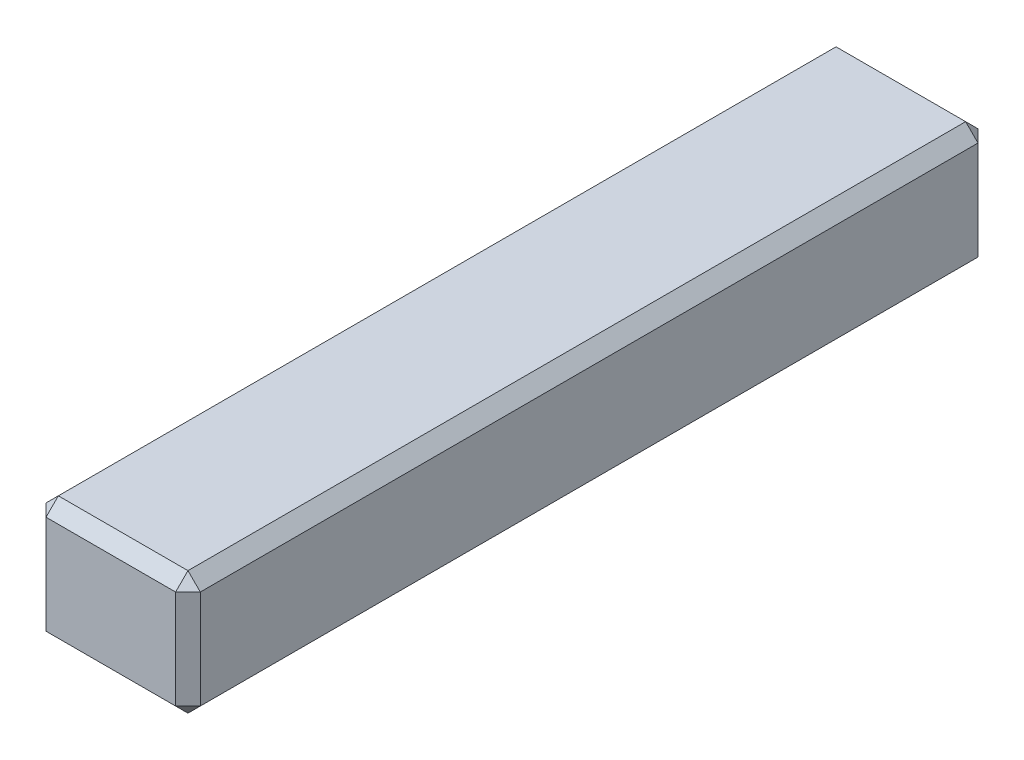
ISO-10303-21;
HEADER;
FILE_DESCRIPTION(('STEP AP214'),'2;1');
FILE_NAME('part.step','',(''),(''),'','','');
FILE_SCHEMA(('AUTOMOTIVE_DESIGN { 1 0 10303 214 1 1 1 1 }'));
ENDSEC;
DATA;
#1=APPLICATION_CONTEXT('core data for automotive mechanical design processes');
#2=APPLICATION_PROTOCOL_DEFINITION('international standard','automotive_design',2000,#1);
#3=PRODUCT_CONTEXT('',#1,'mechanical');
#4=PRODUCT('Part','Part','',(#3));
#5=PRODUCT_RELATED_PRODUCT_CATEGORY('part','',(#4));
#6=PRODUCT_DEFINITION_FORMATION('','',#4);
#7=PRODUCT_DEFINITION_CONTEXT('part definition',#1,'design');
#8=PRODUCT_DEFINITION('design','',#6,#7);
#9=PRODUCT_DEFINITION_SHAPE('','',#8);
#10=(LENGTH_UNIT() NAMED_UNIT(*) SI_UNIT(.MILLI.,.METRE.));
#11=(NAMED_UNIT(*) PLANE_ANGLE_UNIT() SI_UNIT($,.RADIAN.));
#12=(NAMED_UNIT(*) SI_UNIT($,.STERADIAN.) SOLID_ANGLE_UNIT());
#13=UNCERTAINTY_MEASURE_WITH_UNIT(LENGTH_MEASURE(1.E-05),#10,'distance_accuracy_value','');
#14=(GEOMETRIC_REPRESENTATION_CONTEXT(3) GLOBAL_UNCERTAINTY_ASSIGNED_CONTEXT((#13)) GLOBAL_UNIT_ASSIGNED_CONTEXT((#10,
#11,#12)) REPRESENTATION_CONTEXT('',''));
#15=CARTESIAN_POINT('',(0.,0.,0.));
#16=DIRECTION('',(0.,0.,1.));
#17=DIRECTION('',(1.,0.,0.));
#18=AXIS2_PLACEMENT_3D('',#15,#16,#17);
#19=CARTESIAN_POINT('',(1.25,1.,6.5));
#20=DIRECTION('',(-1.,0.,0.));
#21=DIRECTION('',(0.,0.,1.));
#22=AXIS2_PLACEMENT_3D('',#19,#20,#21);
#23=PLANE('',#22);
#24=DIRECTION('',(0.,0.,1.));
#25=VECTOR('',#24,1.);
#26=CARTESIAN_POINT('',(1.25,0.799999999999998,6.5));
#27=LINE('',#26,#25);
#28=CARTESIAN_POINT('',(1.25,0.799999999999998,-6.3));
#29=VERTEX_POINT('',#28);
#30=CARTESIAN_POINT('',(1.25,0.799999999999998,6.3));
#31=VERTEX_POINT('',#30);
#32=EDGE_CURVE('E59',#29,#31,#27,.T.);
#33=ORIENTED_EDGE('',*,*,#32,.T.);
#34=DIRECTION('',(0.,-1.,0.));
#35=VECTOR('',#34,1.);
#36=CARTESIAN_POINT('',(1.25,1.,6.3));
#37=LINE('',#36,#35);
#38=CARTESIAN_POINT('',(1.25,-0.799999999999998,6.3));
#39=VERTEX_POINT('',#38);
#40=EDGE_CURVE('E11',#31,#39,#37,.T.);
#41=ORIENTED_EDGE('',*,*,#40,.T.);
#42=DIRECTION('',(0.,0.,-1.));
#43=VECTOR('',#42,1.);
#44=CARTESIAN_POINT('',(1.25,-0.799999999999998,-6.5));
#45=LINE('',#44,#43);
#46=CARTESIAN_POINT('',(1.25,-0.799999999999998,-6.3));
#47=VERTEX_POINT('',#46);
#48=EDGE_CURVE('E232',#39,#47,#45,.T.);
#49=ORIENTED_EDGE('',*,*,#48,.T.);
#50=DIRECTION('',(0.,1.,0.));
#51=VECTOR('',#50,1.);
#52=CARTESIAN_POINT('',(1.25,1.,-6.3));
#53=LINE('',#52,#51);
#54=EDGE_CURVE('E68',#47,#29,#53,.T.);
#55=ORIENTED_EDGE('',*,*,#54,.T.);
#56=EDGE_LOOP('',(#33,#41,#49,#55));
#57=FACE_BOUND('',#56,.T.);
#58=ADVANCED_FACE('F50',(#57),#23,.F.);
#59=CARTESIAN_POINT('',(-1.25,1.,-6.5));
#60=DIRECTION('',(0.,0.,1.));
#61=DIRECTION('',(1.,0.,0.));
#62=AXIS2_PLACEMENT_3D('',#59,#60,#61);
#63=PLANE('',#62);
#64=DIRECTION('',(0.,1.,0.));
#65=VECTOR('',#64,1.);
#66=CARTESIAN_POINT('',(-1.05,1.,-6.5));
#67=LINE('',#66,#65);
#68=CARTESIAN_POINT('',(-1.05,-0.799999999999998,-6.5));
#69=VERTEX_POINT('',#68);
#70=CARTESIAN_POINT('',(-1.05,0.799999999999998,-6.5));
#71=VERTEX_POINT('',#70);
#72=EDGE_CURVE('E200',#69,#71,#67,.T.);
#73=ORIENTED_EDGE('',*,*,#72,.T.);
#74=DIRECTION('',(1.,0.,0.));
#75=VECTOR('',#74,1.);
#76=CARTESIAN_POINT('',(-1.25,0.799999999999998,-6.5));
#77=LINE('',#76,#75);
#78=CARTESIAN_POINT('',(1.05,0.799999999999998,-6.5));
#79=VERTEX_POINT('',#78);
#80=EDGE_CURVE('E205',#71,#79,#77,.T.);
#81=ORIENTED_EDGE('',*,*,#80,.T.);
#82=DIRECTION('',(0.,-1.,0.));
#83=VECTOR('',#82,1.);
#84=CARTESIAN_POINT('',(1.05,1.,-6.5));
#85=LINE('',#84,#83);
#86=CARTESIAN_POINT('',(1.05,-0.799999999999998,-6.5));
#87=VERTEX_POINT('',#86);
#88=EDGE_CURVE('E194',#79,#87,#85,.T.);
#89=ORIENTED_EDGE('',*,*,#88,.T.);
#90=DIRECTION('',(-1.,0.,0.));
#91=VECTOR('',#90,1.);
#92=CARTESIAN_POINT('',(-1.25,-0.799999999999998,-6.5));
#93=LINE('',#92,#91);
#94=EDGE_CURVE('E198',#87,#69,#93,.T.);
#95=ORIENTED_EDGE('',*,*,#94,.T.);
#96=EDGE_LOOP('',(#73,#81,#89,#95));
#97=FACE_BOUND('',#96,.T.);
#98=ADVANCED_FACE('F380',(#97),#63,.F.);
#99=CARTESIAN_POINT('',(-1.25,1.,6.5));
#100=DIRECTION('',(1.,0.,0.));
#101=DIRECTION('',(0.,0.,-1.));
#102=AXIS2_PLACEMENT_3D('',#99,#100,#101);
#103=PLANE('',#102);
#104=DIRECTION('',(0.,0.,-1.));
#105=VECTOR('',#104,1.);
#106=CARTESIAN_POINT('',(-1.25,0.799999999999998,6.5));
#107=LINE('',#106,#105);
#108=CARTESIAN_POINT('',(-1.25,0.799999999999998,6.3));
#109=VERTEX_POINT('',#108);
#110=CARTESIAN_POINT('',(-1.25,0.799999999999998,-6.3));
#111=VERTEX_POINT('',#110);
#112=EDGE_CURVE('E215',#109,#111,#107,.T.);
#113=ORIENTED_EDGE('',*,*,#112,.T.);
#114=DIRECTION('',(0.,-1.,0.));
#115=VECTOR('',#114,1.);
#116=CARTESIAN_POINT('',(-1.25,1.,-6.3));
#117=LINE('',#116,#115);
#118=CARTESIAN_POINT('',(-1.25,-0.799999999999998,-6.3));
#119=VERTEX_POINT('',#118);
#120=EDGE_CURVE('E214',#111,#119,#117,.T.);
#121=ORIENTED_EDGE('',*,*,#120,.T.);
#122=DIRECTION('',(0.,0.,1.));
#123=VECTOR('',#122,1.);
#124=CARTESIAN_POINT('',(-1.25,-0.799999999999998,6.5));
#125=LINE('',#124,#123);
#126=CARTESIAN_POINT('',(-1.25,-0.799999999999998,6.3));
#127=VERTEX_POINT('',#126);
#128=EDGE_CURVE('E206',#119,#127,#125,.T.);
#129=ORIENTED_EDGE('',*,*,#128,.T.);
#130=DIRECTION('',(0.,1.,0.));
#131=VECTOR('',#130,1.);
#132=CARTESIAN_POINT('',(-1.25,1.,6.3));
#133=LINE('',#132,#131);
#134=EDGE_CURVE('E207',#127,#109,#133,.T.);
#135=ORIENTED_EDGE('',*,*,#134,.T.);
#136=EDGE_LOOP('',(#113,#121,#129,#135));
#137=FACE_BOUND('',#136,.T.);
#138=ADVANCED_FACE('F331',(#137),#103,.F.);
#139=CARTESIAN_POINT('',(-1.25,1.,6.5));
#140=DIRECTION('',(0.,0.,-1.));
#141=DIRECTION('',(-1.,0.,0.));
#142=AXIS2_PLACEMENT_3D('',#139,#140,#141);
#143=PLANE('',#142);
#144=DIRECTION('',(0.,1.,0.));
#145=VECTOR('',#144,1.);
#146=CARTESIAN_POINT('',(1.05,1.,6.5));
#147=LINE('',#146,#145);
#148=CARTESIAN_POINT('',(1.05,-0.799999999999998,6.5));
#149=VERTEX_POINT('',#148);
#150=CARTESIAN_POINT('',(1.05,0.799999999999998,6.5));
#151=VERTEX_POINT('',#150);
#152=EDGE_CURVE('E178',#149,#151,#147,.T.);
#153=ORIENTED_EDGE('',*,*,#152,.T.);
#154=DIRECTION('',(-1.,0.,0.));
#155=VECTOR('',#154,1.);
#156=CARTESIAN_POINT('',(-1.25,0.799999999999998,6.5));
#157=LINE('',#156,#155);
#158=CARTESIAN_POINT('',(-1.05,0.799999999999998,6.5));
#159=VERTEX_POINT('',#158);
#160=EDGE_CURVE('E144',#151,#159,#157,.T.);
#161=ORIENTED_EDGE('',*,*,#160,.T.);
#162=DIRECTION('',(0.,-1.,0.));
#163=VECTOR('',#162,1.);
#164=CARTESIAN_POINT('',(-1.05,1.,6.5));
#165=LINE('',#164,#163);
#166=CARTESIAN_POINT('',(-1.05,-0.799999999999998,6.5));
#167=VERTEX_POINT('',#166);
#168=EDGE_CURVE('E186',#159,#167,#165,.T.);
#169=ORIENTED_EDGE('',*,*,#168,.T.);
#170=DIRECTION('',(1.,0.,0.));
#171=VECTOR('',#170,1.);
#172=CARTESIAN_POINT('',(1.25,-0.799999999999998,6.5));
#173=LINE('',#172,#171);
#174=EDGE_CURVE('E183',#167,#149,#173,.T.);
#175=ORIENTED_EDGE('',*,*,#174,.T.);
#176=EDGE_LOOP('',(#153,#161,#169,#175));
#177=FACE_BOUND('',#176,.T.);
#178=ADVANCED_FACE('F356',(#177),#143,.F.);
#179=CARTESIAN_POINT('',(0.,1.,0.));
#180=DIRECTION('',(0.,-1.,0.));
#181=DIRECTION('',(0.,0.,-1.));
#182=AXIS2_PLACEMENT_3D('',#179,#180,#181);
#183=PLANE('',#182);
#184=DIRECTION('',(-1.,0.,0.));
#185=VECTOR('',#184,1.);
#186=CARTESIAN_POINT('',(0.,1.,-6.3));
#187=LINE('',#186,#185);
#188=CARTESIAN_POINT('',(1.05,1.,-6.3));
#189=VERTEX_POINT('',#188);
#190=CARTESIAN_POINT('',(-1.05,1.,-6.3));
#191=VERTEX_POINT('',#190);
#192=EDGE_CURVE('E166',#189,#191,#187,.T.);
#193=ORIENTED_EDGE('',*,*,#192,.T.);
#194=DIRECTION('',(0.,0.,1.));
#195=VECTOR('',#194,1.);
#196=CARTESIAN_POINT('',(-1.05,1.,0.));
#197=LINE('',#196,#195);
#198=CARTESIAN_POINT('',(-1.05,1.,6.3));
#199=VERTEX_POINT('',#198);
#200=EDGE_CURVE('E171',#191,#199,#197,.T.);
#201=ORIENTED_EDGE('',*,*,#200,.T.);
#202=DIRECTION('',(1.,0.,0.));
#203=VECTOR('',#202,1.);
#204=CARTESIAN_POINT('',(0.,1.,6.3));
#205=LINE('',#204,#203);
#206=CARTESIAN_POINT('',(1.05,1.,6.3));
#207=VERTEX_POINT('',#206);
#208=EDGE_CURVE('E141',#199,#207,#205,.T.);
#209=ORIENTED_EDGE('',*,*,#208,.T.);
#210=DIRECTION('',(0.,0.,-1.));
#211=VECTOR('',#210,1.);
#212=CARTESIAN_POINT('',(1.05,1.,0.));
#213=LINE('',#212,#211);
#214=EDGE_CURVE('E165',#207,#189,#213,.T.);
#215=ORIENTED_EDGE('',*,*,#214,.T.);
#216=EDGE_LOOP('',(#193,#201,#209,#215));
#217=FACE_BOUND('',#216,.T.);
#218=ADVANCED_FACE('F173',(#217),#183,.F.);
#219=CARTESIAN_POINT('',(0.,-1.,0.));
#220=DIRECTION('',(0.,-1.,0.));
#221=DIRECTION('',(0.,0.,-1.));
#222=AXIS2_PLACEMENT_3D('',#219,#220,#221);
#223=PLANE('',#222);
#224=DIRECTION('',(0.,0.,-1.));
#225=VECTOR('',#224,1.);
#226=CARTESIAN_POINT('',(-1.05,-1.,-6.5));
#227=LINE('',#226,#225);
#228=CARTESIAN_POINT('',(-1.05,-1.,6.3));
#229=VERTEX_POINT('',#228);
#230=CARTESIAN_POINT('',(-1.05,-1.,-6.3));
#231=VERTEX_POINT('',#230);
#232=EDGE_CURVE('E223',#229,#231,#227,.T.);
#233=ORIENTED_EDGE('',*,*,#232,.T.);
#234=DIRECTION('',(1.,0.,0.));
#235=VECTOR('',#234,1.);
#236=CARTESIAN_POINT('',(1.25,-1.,-6.3));
#237=LINE('',#236,#235);
#238=CARTESIAN_POINT('',(1.05,-1.,-6.3));
#239=VERTEX_POINT('',#238);
#240=EDGE_CURVE('E226',#231,#239,#237,.T.);
#241=ORIENTED_EDGE('',*,*,#240,.T.);
#242=DIRECTION('',(0.,0.,1.));
#243=VECTOR('',#242,1.);
#244=CARTESIAN_POINT('',(1.05,-1.,6.5));
#245=LINE('',#244,#243);
#246=CARTESIAN_POINT('',(1.05,-1.,6.3));
#247=VERTEX_POINT('',#246);
#248=EDGE_CURVE('E218',#239,#247,#245,.T.);
#249=ORIENTED_EDGE('',*,*,#248,.T.);
#250=DIRECTION('',(-1.,0.,0.));
#251=VECTOR('',#250,1.);
#252=CARTESIAN_POINT('',(-1.25,-1.,6.3));
#253=LINE('',#252,#251);
#254=EDGE_CURVE('E225',#247,#229,#253,.T.);
#255=ORIENTED_EDGE('',*,*,#254,.T.);
#256=EDGE_LOOP('',(#233,#241,#249,#255));
#257=FACE_BOUND('',#256,.T.);
#258=ADVANCED_FACE('F377',(#257),#223,.T.);
#259=CARTESIAN_POINT('',(-1.25,-0.799999999999998,-6.5));
#260=DIRECTION('',(0.,-0.707106781186548,-0.707106781186547));
#261=DIRECTION('',(1.,0.,0.));
#262=AXIS2_PLACEMENT_3D('',#259,#260,#261);
#263=PLANE('',#262);
#264=DIRECTION('',(0.,-0.707106781186547,0.707106781186548));
#265=VECTOR('',#264,1.);
#266=CARTESIAN_POINT('',(-1.05,-0.899999999999999,-6.4));
#267=LINE('',#266,#265);
#268=EDGE_CURVE('E55',#69,#231,#267,.T.);
#269=ORIENTED_EDGE('',*,*,#268,.F.);
#270=ORIENTED_EDGE('',*,*,#94,.F.);
#271=DIRECTION('',(0.,0.707106781186547,-0.707106781186548));
#272=VECTOR('',#271,1.);
#273=CARTESIAN_POINT('',(1.05,-1.,-6.3));
#274=LINE('',#273,#272);
#275=EDGE_CURVE('E310',#239,#87,#274,.T.);
#276=ORIENTED_EDGE('',*,*,#275,.F.);
#277=ORIENTED_EDGE('',*,*,#240,.F.);
#278=EDGE_LOOP('',(#269,#270,#276,#277));
#279=FACE_BOUND('',#278,.T.);
#280=ADVANCED_FACE('F49',(#279),#263,.T.);
#281=CARTESIAN_POINT('',(-1.25,-0.799999999999998,-6.3));
#282=DIRECTION('',(-0.577350269189626,-0.577350269189626,-0.577350269189626));
#283=DIRECTION('',(-0.707106781186547,0.,0.707106781186547));
#284=AXIS2_PLACEMENT_3D('',#281,#282,#283);
#285=PLANE('',#284);
#286=DIRECTION('',(-0.707106781186547,0.,0.707106781186547));
#287=VECTOR('',#286,1.);
#288=CARTESIAN_POINT('',(-1.25,-0.799999999999998,-6.3));
#289=LINE('',#288,#287);
#290=EDGE_CURVE('E302',#69,#119,#289,.T.);
#291=ORIENTED_EDGE('',*,*,#290,.F.);
#292=ORIENTED_EDGE('',*,*,#268,.T.);
#293=DIRECTION('',(-0.707106781186547,0.707106781186547,0.));
#294=VECTOR('',#293,1.);
#295=CARTESIAN_POINT('',(-1.25,-0.799999999999998,-6.3));
#296=LINE('',#295,#294);
#297=EDGE_CURVE('E308',#119,#231,#296,.F.);
#298=ORIENTED_EDGE('',*,*,#297,.F.);
#299=EDGE_LOOP('',(#291,#292,#298));
#300=FACE_BOUND('',#299,.T.);
#301=ADVANCED_FACE('F325',(#300),#285,.T.);
#302=CARTESIAN_POINT('',(1.05,-1.,-6.3));
#303=DIRECTION('',(0.577350269189626,-0.577350269189626,-0.577350269189625));
#304=DIRECTION('',(0.707106781186547,0.707106781186547,0.));
#305=AXIS2_PLACEMENT_3D('',#302,#303,#304);
#306=PLANE('',#305);
#307=DIRECTION('',(-0.707106781186547,-0.707106781186548,0.));
#308=VECTOR('',#307,1.);
#309=CARTESIAN_POINT('',(1.05,-1.,-6.3));
#310=LINE('',#309,#308);
#311=EDGE_CURVE('E294',#239,#47,#310,.F.);
#312=ORIENTED_EDGE('',*,*,#311,.F.);
#313=ORIENTED_EDGE('',*,*,#275,.T.);
#314=DIRECTION('',(-0.707106781186547,0.,-0.707106781186548));
#315=VECTOR('',#314,1.);
#316=CARTESIAN_POINT('',(1.15,-0.799999999999998,-6.4));
#317=LINE('',#316,#315);
#318=EDGE_CURVE('E296',#47,#87,#317,.T.);
#319=ORIENTED_EDGE('',*,*,#318,.F.);
#320=EDGE_LOOP('',(#312,#313,#319));
#321=FACE_BOUND('',#320,.T.);
#322=ADVANCED_FACE('F368',(#321),#306,.T.);
#323=CARTESIAN_POINT('',(-1.25,-0.799999999999998,6.5));
#324=DIRECTION('',(-0.707106781186547,-0.707106781186547,0.));
#325=DIRECTION('',(0.,0.,-1.));
#326=AXIS2_PLACEMENT_3D('',#323,#324,#325);
#327=PLANE('',#326);
#328=ORIENTED_EDGE('',*,*,#297,.T.);
#329=ORIENTED_EDGE('',*,*,#232,.F.);
#330=DIRECTION('',(0.707106781186547,-0.707106781186547,0.));
#331=VECTOR('',#330,1.);
#332=CARTESIAN_POINT('',(-1.15,-0.899999999999999,6.3));
#333=LINE('',#332,#331);
#334=EDGE_CURVE('E286',#127,#229,#333,.T.);
#335=ORIENTED_EDGE('',*,*,#334,.F.);
#336=ORIENTED_EDGE('',*,*,#128,.F.);
#337=EDGE_LOOP('',(#328,#329,#335,#336));
#338=FACE_BOUND('',#337,.T.);
#339=ADVANCED_FACE('F328',(#338),#327,.T.);
#340=CARTESIAN_POINT('',(-1.25,1.,-6.3));
#341=DIRECTION('',(0.707106781186547,0.,0.707106781186547));
#342=DIRECTION('',(0.,-1.,0.));
#343=AXIS2_PLACEMENT_3D('',#340,#341,#342);
#344=PLANE('',#343);
#345=ORIENTED_EDGE('',*,*,#290,.T.);
#346=ORIENTED_EDGE('',*,*,#120,.F.);
#347=DIRECTION('',(0.707106781186547,0.,-0.707106781186547));
#348=VECTOR('',#347,1.);
#349=CARTESIAN_POINT('',(-1.15,0.799999999999998,-6.4));
#350=LINE('',#349,#348);
#351=EDGE_CURVE('E285',#71,#111,#350,.F.);
#352=ORIENTED_EDGE('',*,*,#351,.F.);
#353=ORIENTED_EDGE('',*,*,#72,.F.);
#354=EDGE_LOOP('',(#345,#346,#352,#353));
#355=FACE_BOUND('',#354,.T.);
#356=ADVANCED_FACE('F337',(#355),#344,.F.);
#357=CARTESIAN_POINT('',(0.,1.,-6.3));
#358=DIRECTION('',(0.,-0.707106781186548,0.707106781186547));
#359=DIRECTION('',(-1.,0.,0.));
#360=AXIS2_PLACEMENT_3D('',#357,#358,#359);
#361=PLANE('',#360);
#362=DIRECTION('',(0.,-0.707106781186547,-0.707106781186548));
#363=VECTOR('',#362,1.);
#364=CARTESIAN_POINT('',(1.05,0.799999999999998,-6.5));
#365=LINE('',#364,#363);
#366=EDGE_CURVE('E273',#79,#189,#365,.F.);
#367=ORIENTED_EDGE('',*,*,#366,.F.);
#368=ORIENTED_EDGE('',*,*,#80,.F.);
#369=DIRECTION('',(0.,0.707106781186547,0.707106781186548));
#370=VECTOR('',#369,1.);
#371=CARTESIAN_POINT('',(-1.05,1.,-6.3));
#372=LINE('',#371,#370);
#373=EDGE_CURVE('E279',#191,#71,#372,.F.);
#374=ORIENTED_EDGE('',*,*,#373,.F.);
#375=ORIENTED_EDGE('',*,*,#192,.F.);
#376=EDGE_LOOP('',(#367,#368,#374,#375));
#377=FACE_BOUND('',#376,.T.);
#378=ADVANCED_FACE('F374',(#377),#361,.F.);
#379=CARTESIAN_POINT('',(1.05,1.,-6.5));
#380=DIRECTION('',(-0.707106781186548,0.,0.707106781186547));
#381=DIRECTION('',(0.,-1.,0.));
#382=AXIS2_PLACEMENT_3D('',#379,#380,#381);
#383=PLANE('',#382);
#384=ORIENTED_EDGE('',*,*,#318,.T.);
#385=ORIENTED_EDGE('',*,*,#88,.F.);
#386=DIRECTION('',(0.707106781186547,0.,0.707106781186548));
#387=VECTOR('',#386,1.);
#388=CARTESIAN_POINT('',(1.05,0.799999999999998,-6.5));
#389=LINE('',#388,#387);
#390=EDGE_CURVE('E271',#29,#79,#389,.F.);
#391=ORIENTED_EDGE('',*,*,#390,.F.);
#392=ORIENTED_EDGE('',*,*,#54,.F.);
#393=EDGE_LOOP('',(#384,#385,#391,#392));
#394=FACE_BOUND('',#393,.T.);
#395=ADVANCED_FACE('F369',(#394),#383,.F.);
#396=CARTESIAN_POINT('',(1.25,-0.799999999999998,6.5));
#397=DIRECTION('',(0.707106781186548,-0.707106781186547,0.));
#398=DIRECTION('',(0.,0.,1.));
#399=AXIS2_PLACEMENT_3D('',#396,#397,#398);
#400=PLANE('',#399);
#401=ORIENTED_EDGE('',*,*,#311,.T.);
#402=ORIENTED_EDGE('',*,*,#48,.F.);
#403=DIRECTION('',(0.707106781186547,0.707106781186548,0.));
#404=VECTOR('',#403,1.);
#405=CARTESIAN_POINT('',(1.15,-0.899999999999999,6.3));
#406=LINE('',#405,#404);
#407=EDGE_CURVE('E270',#247,#39,#406,.T.);
#408=ORIENTED_EDGE('',*,*,#407,.F.);
#409=ORIENTED_EDGE('',*,*,#248,.F.);
#410=EDGE_LOOP('',(#401,#402,#408,#409));
#411=FACE_BOUND('',#410,.T.);
#412=ADVANCED_FACE('F364',(#411),#400,.T.);
#413=CARTESIAN_POINT('',(-1.25,-0.799999999999998,6.5));
#414=DIRECTION('',(0.,-0.707106781186547,0.707106781186548));
#415=DIRECTION('',(-1.,0.,0.));
#416=AXIS2_PLACEMENT_3D('',#413,#414,#415);
#417=PLANE('',#416);
#418=DIRECTION('',(0.,0.707106781186548,0.707106781186547));
#419=VECTOR('',#418,1.);
#420=CARTESIAN_POINT('',(-1.05,-0.799999999999998,6.5));
#421=LINE('',#420,#419);
#422=EDGE_CURVE('E290',#229,#167,#421,.T.);
#423=ORIENTED_EDGE('',*,*,#422,.F.);
#424=ORIENTED_EDGE('',*,*,#254,.F.);
#425=DIRECTION('',(0.,-0.707106781186548,-0.707106781186547));
#426=VECTOR('',#425,1.);
#427=CARTESIAN_POINT('',(1.05,-0.799999999999998,6.5));
#428=LINE('',#427,#426);
#429=EDGE_CURVE('E263',#149,#247,#428,.T.);
#430=ORIENTED_EDGE('',*,*,#429,.F.);
#431=ORIENTED_EDGE('',*,*,#174,.F.);
#432=EDGE_LOOP('',(#423,#424,#430,#431));
#433=FACE_BOUND('',#432,.T.);
#434=ADVANCED_FACE('F385',(#433),#417,.T.);
#435=CARTESIAN_POINT('',(-1.05,-0.799999999999998,6.5));
#436=DIRECTION('',(-0.577350269189627,-0.577350269189624,0.577350269189627));
#437=DIRECTION('',(0.707106781186547,0.,0.707106781186547));
#438=AXIS2_PLACEMENT_3D('',#435,#436,#437);
#439=PLANE('',#438);
#440=ORIENTED_EDGE('',*,*,#334,.T.);
#441=ORIENTED_EDGE('',*,*,#422,.T.);
#442=DIRECTION('',(0.707106781186547,0.,0.707106781186547));
#443=VECTOR('',#442,1.);
#444=CARTESIAN_POINT('',(-1.05,-0.799999999999998,6.5));
#445=LINE('',#444,#443);
#446=EDGE_CURVE('E259',#127,#167,#445,.T.);
#447=ORIENTED_EDGE('',*,*,#446,.F.);
#448=EDGE_LOOP('',(#440,#441,#447));
#449=FACE_BOUND('',#448,.T.);
#450=ADVANCED_FACE('F446',(#449),#439,.T.);
#451=CARTESIAN_POINT('',(-1.05,1.,-6.3));
#452=DIRECTION('',(-0.577350269189626,0.577350269189626,-0.577350269189626));
#453=DIRECTION('',(-0.707106781186547,0.,0.707106781186547));
#454=AXIS2_PLACEMENT_3D('',#451,#452,#453);
#455=PLANE('',#454);
#456=ORIENTED_EDGE('',*,*,#373,.T.);
#457=ORIENTED_EDGE('',*,*,#351,.T.);
#458=DIRECTION('',(-0.707106781186547,-0.707106781186547,0.));
#459=VECTOR('',#458,1.);
#460=CARTESIAN_POINT('',(-1.05,1.,-6.3));
#461=LINE('',#460,#459);
#462=EDGE_CURVE('E254',#191,#111,#461,.T.);
#463=ORIENTED_EDGE('',*,*,#462,.F.);
#464=EDGE_LOOP('',(#456,#457,#463));
#465=FACE_BOUND('',#464,.T.);
#466=ADVANCED_FACE('F344',(#465),#455,.T.);
#467=CARTESIAN_POINT('',(1.05,0.799999999999998,-6.5));
#468=DIRECTION('',(0.577350269189626,0.577350269189626,-0.577350269189625));
#469=DIRECTION('',(-0.707106781186548,0.707106781186548,0.));
#470=AXIS2_PLACEMENT_3D('',#467,#468,#469);
#471=PLANE('',#470);
#472=ORIENTED_EDGE('',*,*,#390,.T.);
#473=ORIENTED_EDGE('',*,*,#366,.T.);
#474=DIRECTION('',(-0.707106781186547,0.707106781186548,0.));
#475=VECTOR('',#474,1.);
#476=CARTESIAN_POINT('',(1.15,0.899999999999999,-6.3));
#477=LINE('',#476,#475);
#478=EDGE_CURVE('E164',#29,#189,#477,.T.);
#479=ORIENTED_EDGE('',*,*,#478,.F.);
#480=EDGE_LOOP('',(#472,#473,#479));
#481=FACE_BOUND('',#480,.T.);
#482=ADVANCED_FACE('F375',(#481),#471,.T.);
#483=CARTESIAN_POINT('',(1.05,-0.799999999999998,6.5));
#484=DIRECTION('',(0.577350269189627,-0.577350269189624,0.577350269189627));
#485=DIRECTION('',(0.707106781186547,0.,-0.707106781186547));
#486=AXIS2_PLACEMENT_3D('',#483,#484,#485);
#487=PLANE('',#486);
#488=ORIENTED_EDGE('',*,*,#429,.T.);
#489=ORIENTED_EDGE('',*,*,#407,.T.);
#490=DIRECTION('',(0.707106781186547,0.,-0.707106781186547));
#491=VECTOR('',#490,1.);
#492=CARTESIAN_POINT('',(1.05,-0.799999999999998,6.5));
#493=LINE('',#492,#491);
#494=EDGE_CURVE('E250',#149,#39,#493,.T.);
#495=ORIENTED_EDGE('',*,*,#494,.F.);
#496=EDGE_LOOP('',(#488,#489,#495));
#497=FACE_BOUND('',#496,.T.);
#498=ADVANCED_FACE('F383',(#497),#487,.T.);
#499=CARTESIAN_POINT('',(-1.05,1.,6.5));
#500=DIRECTION('',(0.707106781186547,0.,-0.707106781186547));
#501=DIRECTION('',(0.,-1.,0.));
#502=AXIS2_PLACEMENT_3D('',#499,#500,#501);
#503=PLANE('',#502);
#504=ORIENTED_EDGE('',*,*,#446,.T.);
#505=ORIENTED_EDGE('',*,*,#168,.F.);
#506=DIRECTION('',(-0.707106781186547,0.,-0.707106781186547));
#507=VECTOR('',#506,1.);
#508=CARTESIAN_POINT('',(-1.05,0.799999999999998,6.5));
#509=LINE('',#508,#507);
#510=EDGE_CURVE('E246',#109,#159,#509,.F.);
#511=ORIENTED_EDGE('',*,*,#510,.F.);
#512=ORIENTED_EDGE('',*,*,#134,.F.);
#513=EDGE_LOOP('',(#504,#505,#511,#512));
#514=FACE_BOUND('',#513,.T.);
#515=ADVANCED_FACE('F351',(#514),#503,.F.);
#516=CARTESIAN_POINT('',(-1.05,1.,0.));
#517=DIRECTION('',(0.707106781186547,-0.707106781186547,0.));
#518=DIRECTION('',(0.,0.,1.));
#519=AXIS2_PLACEMENT_3D('',#516,#517,#518);
#520=PLANE('',#519);
#521=ORIENTED_EDGE('',*,*,#462,.T.);
#522=ORIENTED_EDGE('',*,*,#112,.F.);
#523=DIRECTION('',(0.707106781186547,0.707106781186547,0.));
#524=VECTOR('',#523,1.);
#525=CARTESIAN_POINT('',(-1.15,0.899999999999999,6.3));
#526=LINE('',#525,#524);
#527=EDGE_CURVE('E157',#199,#109,#526,.F.);
#528=ORIENTED_EDGE('',*,*,#527,.F.);
#529=ORIENTED_EDGE('',*,*,#200,.F.);
#530=EDGE_LOOP('',(#521,#522,#528,#529));
#531=FACE_BOUND('',#530,.T.);
#532=ADVANCED_FACE('F347',(#531),#520,.F.);
#533=CARTESIAN_POINT('',(1.05,1.,0.));
#534=DIRECTION('',(-0.707106781186548,-0.707106781186547,0.));
#535=DIRECTION('',(0.,0.,-1.));
#536=AXIS2_PLACEMENT_3D('',#533,#534,#535);
#537=PLANE('',#536);
#538=ORIENTED_EDGE('',*,*,#478,.T.);
#539=ORIENTED_EDGE('',*,*,#214,.F.);
#540=DIRECTION('',(0.707106781186547,-0.707106781186548,0.));
#541=VECTOR('',#540,1.);
#542=CARTESIAN_POINT('',(1.05,1.,6.3));
#543=LINE('',#542,#541);
#544=EDGE_CURVE('E155',#31,#207,#543,.F.);
#545=ORIENTED_EDGE('',*,*,#544,.F.);
#546=ORIENTED_EDGE('',*,*,#32,.F.);
#547=EDGE_LOOP('',(#538,#539,#545,#546));
#548=FACE_BOUND('',#547,.T.);
#549=ADVANCED_FACE('F162',(#548),#537,.F.);
#550=CARTESIAN_POINT('',(1.25,1.,6.3));
#551=DIRECTION('',(-0.707106781186547,0.,-0.707106781186547));
#552=DIRECTION('',(0.,-1.,0.));
#553=AXIS2_PLACEMENT_3D('',#550,#551,#552);
#554=PLANE('',#553);
#555=ORIENTED_EDGE('',*,*,#494,.T.);
#556=ORIENTED_EDGE('',*,*,#40,.F.);
#557=DIRECTION('',(-0.707106781186547,0.,0.707106781186547));
#558=VECTOR('',#557,1.);
#559=CARTESIAN_POINT('',(1.15,0.799999999999998,6.4));
#560=LINE('',#559,#558);
#561=EDGE_CURVE('E156',#151,#31,#560,.F.);
#562=ORIENTED_EDGE('',*,*,#561,.F.);
#563=ORIENTED_EDGE('',*,*,#152,.F.);
#564=EDGE_LOOP('',(#555,#556,#562,#563));
#565=FACE_BOUND('',#564,.T.);
#566=ADVANCED_FACE('F360',(#565),#554,.F.);
#567=CARTESIAN_POINT('',(-1.05,0.799999999999998,6.5));
#568=DIRECTION('',(-0.577350269189627,0.577350269189624,0.577350269189627));
#569=DIRECTION('',(0.707106781186547,0.,0.707106781186547));
#570=AXIS2_PLACEMENT_3D('',#567,#568,#569);
#571=PLANE('',#570);
#572=ORIENTED_EDGE('',*,*,#527,.T.);
#573=ORIENTED_EDGE('',*,*,#510,.T.);
#574=DIRECTION('',(0.,-0.707106781186548,0.707106781186547));
#575=VECTOR('',#574,1.);
#576=CARTESIAN_POINT('',(-1.05,0.799999999999998,6.5));
#577=LINE('',#576,#575);
#578=EDGE_CURVE('E149',#199,#159,#577,.T.);
#579=ORIENTED_EDGE('',*,*,#578,.F.);
#580=EDGE_LOOP('',(#572,#573,#579));
#581=FACE_BOUND('',#580,.T.);
#582=ADVANCED_FACE('F348',(#581),#571,.T.);
#583=CARTESIAN_POINT('',(1.05,1.,6.3));
#584=DIRECTION('',(0.577350269189627,0.577350269189624,0.577350269189627));
#585=DIRECTION('',(0.707106781186547,0.,-0.707106781186547));
#586=AXIS2_PLACEMENT_3D('',#583,#584,#585);
#587=PLANE('',#586);
#588=ORIENTED_EDGE('',*,*,#561,.T.);
#589=ORIENTED_EDGE('',*,*,#544,.T.);
#590=DIRECTION('',(0.,0.707106781186548,-0.707106781186547));
#591=VECTOR('',#590,1.);
#592=CARTESIAN_POINT('',(1.05,1.,6.3));
#593=LINE('',#592,#591);
#594=EDGE_CURVE('E138',#151,#207,#593,.T.);
#595=ORIENTED_EDGE('',*,*,#594,.F.);
#596=EDGE_LOOP('',(#588,#589,#595));
#597=FACE_BOUND('',#596,.T.);
#598=ADVANCED_FACE('F152',(#597),#587,.T.);
#599=CARTESIAN_POINT('',(0.,1.,6.3));
#600=DIRECTION('',(0.,-0.707106781186547,-0.707106781186548));
#601=DIRECTION('',(1.,0.,0.));
#602=AXIS2_PLACEMENT_3D('',#599,#600,#601);
#603=PLANE('',#602);
#604=ORIENTED_EDGE('',*,*,#578,.T.);
#605=ORIENTED_EDGE('',*,*,#160,.F.);
#606=ORIENTED_EDGE('',*,*,#594,.T.);
#607=ORIENTED_EDGE('',*,*,#208,.F.);
#608=EDGE_LOOP('',(#604,#605,#606,#607));
#609=FACE_BOUND('',#608,.T.);
#610=ADVANCED_FACE('F143',(#609),#603,.F.);
#611=CLOSED_SHELL('',(#58,#98,#138,#178,#218,#258,#280,#301,#322,#339,#356,#378,#395,#412,#434,
#450,#466,#482,#498,#515,#532,#549,#566,#582,#598,#610));
#612=MANIFOLD_SOLID_BREP('B2',#611);
#613=ADVANCED_BREP_SHAPE_REPRESENTATION('',(#18,#612),#14);
#614=SHAPE_DEFINITION_REPRESENTATION(#9,#613);
ENDSEC;
END-ISO-10303-21;
